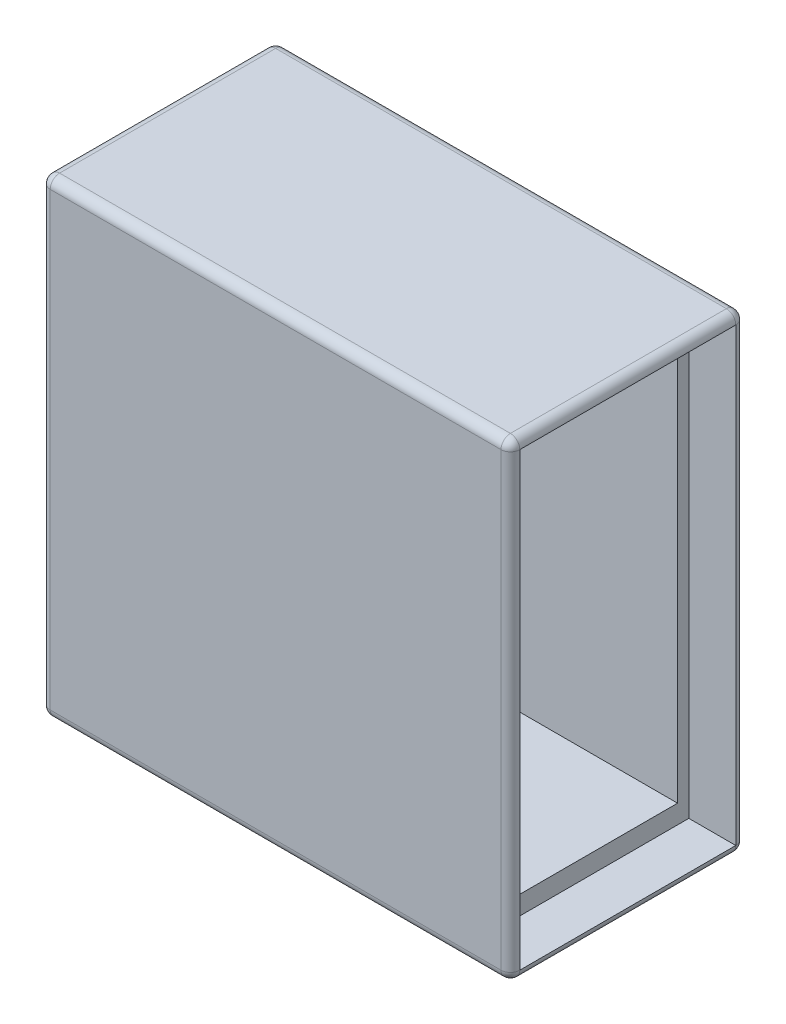
ISO-10303-21;
HEADER;
FILE_DESCRIPTION(('STEP AP214'),'2;1');
FILE_NAME('part.step','',(''),(''),'','','');
FILE_SCHEMA(('AUTOMOTIVE_DESIGN { 1 0 10303 214 1 1 1 1 }'));
ENDSEC;
DATA;
#1=APPLICATION_CONTEXT('core data for automotive mechanical design processes');
#2=APPLICATION_PROTOCOL_DEFINITION('international standard','automotive_design',2000,#1);
#3=PRODUCT_CONTEXT('',#1,'mechanical');
#4=PRODUCT('Part','Part','',(#3));
#5=PRODUCT_RELATED_PRODUCT_CATEGORY('part','',(#4));
#6=PRODUCT_DEFINITION_FORMATION('','',#4);
#7=PRODUCT_DEFINITION_CONTEXT('part definition',#1,'design');
#8=PRODUCT_DEFINITION('design','',#6,#7);
#9=PRODUCT_DEFINITION_SHAPE('','',#8);
#10=(LENGTH_UNIT() NAMED_UNIT(*) SI_UNIT(.MILLI.,.METRE.));
#11=(NAMED_UNIT(*) PLANE_ANGLE_UNIT() SI_UNIT($,.RADIAN.));
#12=(NAMED_UNIT(*) SI_UNIT($,.STERADIAN.) SOLID_ANGLE_UNIT());
#13=UNCERTAINTY_MEASURE_WITH_UNIT(LENGTH_MEASURE(1.E-05),#10,'distance_accuracy_value','');
#14=(GEOMETRIC_REPRESENTATION_CONTEXT(3) GLOBAL_UNCERTAINTY_ASSIGNED_CONTEXT((#13)) GLOBAL_UNIT_ASSIGNED_CONTEXT((#10,
#11,#12)) REPRESENTATION_CONTEXT('',''));
#15=CARTESIAN_POINT('',(0.,0.,0.));
#16=DIRECTION('',(0.,0.,1.));
#17=DIRECTION('',(1.,0.,0.));
#18=AXIS2_PLACEMENT_3D('',#15,#16,#17);
#19=CARTESIAN_POINT('',(5.,50.,-25.));
#20=DIRECTION('',(-1.,0.,0.));
#21=DIRECTION('',(0.,0.,1.));
#22=AXIS2_PLACEMENT_3D('',#19,#20,#21);
#23=PLANE('',#22);
#24=CARTESIAN_POINT('',(5.,8.12499999999999,-12.5));
#25=DIRECTION('',(-1.,0.,0.));
#26=DIRECTION('',(0.,0.,1.));
#27=AXIS2_PLACEMENT_3D('',#24,#25,#26);
#28=CIRCLE('',#27,3.125);
#29=CARTESIAN_POINT('',(5.,8.12499999999999,-9.375));
#30=VERTEX_POINT('',#29);
#31=EDGE_CURVE('E229',#30,#30,#28,.T.);
#32=ORIENTED_EDGE('',*,*,#31,.T.);
#33=EDGE_LOOP('',(#32));
#34=FACE_BOUND('',#33,.T.);
#35=CARTESIAN_POINT('',(5.,28.,-19.5));
#36=DIRECTION('',(-1.,0.,0.));
#37=DIRECTION('',(0.,0.,1.));
#38=AXIS2_PLACEMENT_3D('',#35,#36,#37);
#39=CIRCLE('',#38,3.125);
#40=CARTESIAN_POINT('',(5.,28.,-16.375));
#41=VERTEX_POINT('',#40);
#42=EDGE_CURVE('E223',#41,#41,#39,.T.);
#43=ORIENTED_EDGE('',*,*,#42,.T.);
#44=EDGE_LOOP('',(#43));
#45=FACE_BOUND('',#44,.T.);
#46=CARTESIAN_POINT('',(5.,18.625,-19.5));
#47=DIRECTION('',(-1.,0.,0.));
#48=DIRECTION('',(0.,0.,1.));
#49=AXIS2_PLACEMENT_3D('',#46,#47,#48);
#50=CIRCLE('',#49,3.125);
#51=CARTESIAN_POINT('',(5.,18.625,-16.375));
#52=VERTEX_POINT('',#51);
#53=EDGE_CURVE('E226',#52,#52,#50,.T.);
#54=ORIENTED_EDGE('',*,*,#53,.T.);
#55=EDGE_LOOP('',(#54));
#56=FACE_BOUND('',#55,.T.);
#57=CARTESIAN_POINT('',(5.,28.,-5.5));
#58=DIRECTION('',(-1.,0.,0.));
#59=DIRECTION('',(0.,0.,1.));
#60=AXIS2_PLACEMENT_3D('',#57,#58,#59);
#61=CIRCLE('',#60,3.125);
#62=CARTESIAN_POINT('',(5.,28.,-2.375));
#63=VERTEX_POINT('',#62);
#64=EDGE_CURVE('E220',#63,#63,#61,.T.);
#65=ORIENTED_EDGE('',*,*,#64,.T.);
#66=EDGE_LOOP('',(#65));
#67=FACE_BOUND('',#66,.T.);
#68=CARTESIAN_POINT('',(5.,18.625,-5.5));
#69=DIRECTION('',(-1.,0.,0.));
#70=DIRECTION('',(0.,0.,1.));
#71=AXIS2_PLACEMENT_3D('',#68,#69,#70);
#72=CIRCLE('',#71,3.125);
#73=CARTESIAN_POINT('',(5.,18.625,-2.375));
#74=VERTEX_POINT('',#73);
#75=EDGE_CURVE('E206',#74,#74,#72,.T.);
#76=ORIENTED_EDGE('',*,*,#75,.T.);
#77=EDGE_LOOP('',(#76));
#78=FACE_BOUND('',#77,.T.);
#79=CARTESIAN_POINT('',(5.,40.625,-12.4883404816494));
#80=DIRECTION('',(-1.,0.,0.));
#81=DIRECTION('',(0.,0.,1.));
#82=AXIS2_PLACEMENT_3D('',#79,#80,#81);
#83=CIRCLE('',#82,3.75);
#84=CARTESIAN_POINT('',(5.,40.625,-8.73834048164937));
#85=VERTEX_POINT('',#84);
#86=EDGE_CURVE('E256',#85,#85,#83,.T.);
#87=ORIENTED_EDGE('',*,*,#86,.T.);
#88=EDGE_LOOP('',(#87));
#89=FACE_BOUND('',#88,.T.);
#90=DIRECTION('',(0.,0.,1.));
#91=VECTOR('',#90,1.);
#92=CARTESIAN_POINT('',(5.,47.,-2.20000000000001));
#93=LINE('',#92,#91);
#94=CARTESIAN_POINT('',(5.,47.,-22.8));
#95=VERTEX_POINT('',#94);
#96=CARTESIAN_POINT('',(5.,47.,-2.20000000000001));
#97=VERTEX_POINT('',#96);
#98=EDGE_CURVE('E167',#95,#97,#93,.T.);
#99=ORIENTED_EDGE('',*,*,#98,.T.);
#100=DIRECTION('',(0.,-1.,0.));
#101=VECTOR('',#100,1.);
#102=CARTESIAN_POINT('',(5.,3.,-2.2));
#103=LINE('',#102,#101);
#104=CARTESIAN_POINT('',(5.,3.,-2.2));
#105=VERTEX_POINT('',#104);
#106=EDGE_CURVE('E176',#97,#105,#103,.T.);
#107=ORIENTED_EDGE('',*,*,#106,.T.);
#108=DIRECTION('',(0.,0.,-1.));
#109=VECTOR('',#108,1.);
#110=CARTESIAN_POINT('',(5.,3.,-22.8));
#111=LINE('',#110,#109);
#112=CARTESIAN_POINT('',(5.,3.,-22.8));
#113=VERTEX_POINT('',#112);
#114=EDGE_CURVE('E181',#105,#113,#111,.T.);
#115=ORIENTED_EDGE('',*,*,#114,.T.);
#116=DIRECTION('',(0.,1.,0.));
#117=VECTOR('',#116,1.);
#118=CARTESIAN_POINT('',(5.,47.,-22.8));
#119=LINE('',#118,#117);
#120=EDGE_CURVE('E173',#113,#95,#119,.T.);
#121=ORIENTED_EDGE('',*,*,#120,.T.);
#122=EDGE_LOOP('',(#99,#107,#115,#121));
#123=FACE_BOUND('',#122,.T.);
#124=ADVANCED_FACE('F38',(#34,#45,#56,#67,#78,#89,#123),#23,.F.);
#125=CARTESIAN_POINT('',(17.5,40.625,-12.4883404816494));
#126=DIRECTION('',(-1.,0.,0.));
#127=DIRECTION('',(0.,0.,1.));
#128=AXIS2_PLACEMENT_3D('',#125,#126,#127);
#129=CYLINDRICAL_SURFACE('',#128,3.75);
#130=CARTESIAN_POINT('',(0.,40.625,-12.4883404816494));
#131=DIRECTION('',(-1.,0.,0.));
#132=DIRECTION('',(0.,0.,1.));
#133=AXIS2_PLACEMENT_3D('',#130,#131,#132);
#134=CIRCLE('',#133,3.75);
#135=CARTESIAN_POINT('',(0.,40.625,-8.73834048164937));
#136=VERTEX_POINT('',#135);
#137=EDGE_CURVE('E253',#136,#136,#134,.T.);
#138=ORIENTED_EDGE('',*,*,#137,.T.);
#139=EDGE_LOOP('',(#138));
#140=FACE_BOUND('',#139,.T.);
#141=ORIENTED_EDGE('',*,*,#86,.F.);
#142=EDGE_LOOP('',(#141));
#143=FACE_BOUND('',#142,.T.);
#144=ADVANCED_FACE('F449',(#140,#143),#129,.F.);
#145=CARTESIAN_POINT('',(0.,50.,-25.));
#146=DIRECTION('',(-1.,0.,0.));
#147=DIRECTION('',(0.,0.,1.));
#148=AXIS2_PLACEMENT_3D('',#145,#146,#147);
#149=PLANE('',#148);
#150=CARTESIAN_POINT('',(0.,8.12499999999999,-12.5));
#151=DIRECTION('',(-1.,0.,0.));
#152=DIRECTION('',(0.,0.,1.));
#153=AXIS2_PLACEMENT_3D('',#150,#151,#152);
#154=CIRCLE('',#153,3.125);
#155=CARTESIAN_POINT('',(0.,8.12499999999999,-9.375));
#156=VERTEX_POINT('',#155);
#157=EDGE_CURVE('E203',#156,#156,#154,.T.);
#158=ORIENTED_EDGE('',*,*,#157,.F.);
#159=EDGE_LOOP('',(#158));
#160=FACE_BOUND('',#159,.T.);
#161=CARTESIAN_POINT('',(0.,18.625,-19.5));
#162=DIRECTION('',(-1.,0.,0.));
#163=DIRECTION('',(0.,0.,1.));
#164=AXIS2_PLACEMENT_3D('',#161,#162,#163);
#165=CIRCLE('',#164,3.125);
#166=CARTESIAN_POINT('',(0.,18.625,-16.375));
#167=VERTEX_POINT('',#166);
#168=EDGE_CURVE('E207',#167,#167,#165,.T.);
#169=ORIENTED_EDGE('',*,*,#168,.F.);
#170=EDGE_LOOP('',(#169));
#171=FACE_BOUND('',#170,.T.);
#172=CARTESIAN_POINT('',(0.,28.,-19.5));
#173=DIRECTION('',(-1.,0.,0.));
#174=DIRECTION('',(0.,0.,1.));
#175=AXIS2_PLACEMENT_3D('',#172,#173,#174);
#176=CIRCLE('',#175,3.125);
#177=CARTESIAN_POINT('',(0.,28.,-16.375));
#178=VERTEX_POINT('',#177);
#179=EDGE_CURVE('E210',#178,#178,#176,.T.);
#180=ORIENTED_EDGE('',*,*,#179,.F.);
#181=EDGE_LOOP('',(#180));
#182=FACE_BOUND('',#181,.T.);
#183=CARTESIAN_POINT('',(0.,28.,-5.5));
#184=DIRECTION('',(-1.,0.,0.));
#185=DIRECTION('',(0.,0.,1.));
#186=AXIS2_PLACEMENT_3D('',#183,#184,#185);
#187=CIRCLE('',#186,3.125);
#188=CARTESIAN_POINT('',(0.,28.,-2.375));
#189=VERTEX_POINT('',#188);
#190=EDGE_CURVE('E213',#189,#189,#187,.T.);
#191=ORIENTED_EDGE('',*,*,#190,.F.);
#192=EDGE_LOOP('',(#191));
#193=FACE_BOUND('',#192,.T.);
#194=CARTESIAN_POINT('',(0.,18.625,-5.5));
#195=DIRECTION('',(-1.,0.,0.));
#196=DIRECTION('',(0.,0.,1.));
#197=AXIS2_PLACEMENT_3D('',#194,#195,#196);
#198=CIRCLE('',#197,3.125);
#199=CARTESIAN_POINT('',(0.,18.625,-2.375));
#200=VERTEX_POINT('',#199);
#201=EDGE_CURVE('E199',#200,#200,#198,.T.);
#202=ORIENTED_EDGE('',*,*,#201,.F.);
#203=EDGE_LOOP('',(#202));
#204=FACE_BOUND('',#203,.T.);
#205=DIRECTION('',(0.,-1.,0.));
#206=VECTOR('',#205,1.);
#207=CARTESIAN_POINT('',(0.,50.,-1.));
#208=LINE('',#207,#206);
#209=CARTESIAN_POINT('',(0.,1.,-1.));
#210=VERTEX_POINT('',#209);
#211=CARTESIAN_POINT('',(0.,49.,-1.));
#212=VERTEX_POINT('',#211);
#213=EDGE_CURVE('E268',#210,#212,#208,.F.);
#214=ORIENTED_EDGE('',*,*,#213,.T.);
#215=DIRECTION('',(0.,0.,1.));
#216=VECTOR('',#215,1.);
#217=CARTESIAN_POINT('',(0.,49.,-25.));
#218=LINE('',#217,#216);
#219=CARTESIAN_POINT('',(0.,49.,-24.));
#220=VERTEX_POINT('',#219);
#221=EDGE_CURVE('E274',#212,#220,#218,.F.);
#222=ORIENTED_EDGE('',*,*,#221,.T.);
#223=DIRECTION('',(0.,-1.,0.));
#224=VECTOR('',#223,1.);
#225=CARTESIAN_POINT('',(0.,0.,-24.));
#226=LINE('',#225,#224);
#227=CARTESIAN_POINT('',(0.,1.,-24.));
#228=VERTEX_POINT('',#227);
#229=EDGE_CURVE('E272',#220,#228,#226,.T.);
#230=ORIENTED_EDGE('',*,*,#229,.T.);
#231=DIRECTION('',(0.,0.,1.));
#232=VECTOR('',#231,1.);
#233=CARTESIAN_POINT('',(0.,1.,-25.));
#234=LINE('',#233,#232);
#235=EDGE_CURVE('E270',#228,#210,#234,.T.);
#236=ORIENTED_EDGE('',*,*,#235,.T.);
#237=EDGE_LOOP('',(#214,#222,#230,#236));
#238=FACE_BOUND('',#237,.T.);
#239=ORIENTED_EDGE('',*,*,#137,.F.);
#240=EDGE_LOOP('',(#239));
#241=FACE_BOUND('',#240,.T.);
#242=ADVANCED_FACE('F457',(#160,#171,#182,#193,#204,#238,#241),#149,.T.);
#243=CARTESIAN_POINT('',(50.,50.,-25.));
#244=DIRECTION('',(0.,1.,0.));
#245=DIRECTION('',(-1.,0.,0.));
#246=AXIS2_PLACEMENT_3D('',#243,#244,#245);
#247=PLANE('',#246);
#248=DIRECTION('',(-1.,0.,0.));
#249=VECTOR('',#248,1.);
#250=CARTESIAN_POINT('',(0.,50.,-24.));
#251=LINE('',#250,#249);
#252=CARTESIAN_POINT('',(49.,50.,-24.));
#253=VERTEX_POINT('',#252);
#254=CARTESIAN_POINT('',(1.,50.,-24.));
#255=VERTEX_POINT('',#254);
#256=EDGE_CURVE('E263',#253,#255,#251,.T.);
#257=ORIENTED_EDGE('',*,*,#256,.T.);
#258=DIRECTION('',(0.,0.,1.));
#259=VECTOR('',#258,1.);
#260=CARTESIAN_POINT('',(1.,50.,-25.));
#261=LINE('',#260,#259);
#262=CARTESIAN_POINT('',(1.,50.,-1.));
#263=VERTEX_POINT('',#262);
#264=EDGE_CURVE('E265',#255,#263,#261,.T.);
#265=ORIENTED_EDGE('',*,*,#264,.T.);
#266=DIRECTION('',(-1.,0.,0.));
#267=VECTOR('',#266,1.);
#268=CARTESIAN_POINT('',(50.,50.,-1.));
#269=LINE('',#268,#267);
#270=CARTESIAN_POINT('',(49.,50.,-1.));
#271=VERTEX_POINT('',#270);
#272=EDGE_CURVE('E259',#263,#271,#269,.F.);
#273=ORIENTED_EDGE('',*,*,#272,.T.);
#274=DIRECTION('',(0.,0.,1.));
#275=VECTOR('',#274,1.);
#276=CARTESIAN_POINT('',(49.,50.,-25.));
#277=LINE('',#276,#275);
#278=EDGE_CURVE('E261',#271,#253,#277,.F.);
#279=ORIENTED_EDGE('',*,*,#278,.T.);
#280=EDGE_LOOP('',(#257,#265,#273,#279));
#281=FACE_BOUND('',#280,.T.);
#282=ADVANCED_FACE('F625',(#281),#247,.T.);
#283=CARTESIAN_POINT('',(0.,0.,-25.));
#284=DIRECTION('',(0.,-1.,0.));
#285=DIRECTION('',(0.,0.,-1.));
#286=AXIS2_PLACEMENT_3D('',#283,#284,#285);
#287=PLANE('',#286);
#288=DIRECTION('',(0.,0.,1.));
#289=VECTOR('',#288,1.);
#290=CARTESIAN_POINT('',(1.,0.,-25.));
#291=LINE('',#290,#289);
#292=CARTESIAN_POINT('',(1.,0.,-1.));
#293=VERTEX_POINT('',#292);
#294=CARTESIAN_POINT('',(1.,0.,-24.));
#295=VERTEX_POINT('',#294);
#296=EDGE_CURVE('E286',#293,#295,#291,.F.);
#297=ORIENTED_EDGE('',*,*,#296,.T.);
#298=DIRECTION('',(1.,0.,0.));
#299=VECTOR('',#298,1.);
#300=CARTESIAN_POINT('',(50.,0.,-24.));
#301=LINE('',#300,#299);
#302=CARTESIAN_POINT('',(49.,0.,-24.));
#303=VERTEX_POINT('',#302);
#304=EDGE_CURVE('E292',#295,#303,#301,.T.);
#305=ORIENTED_EDGE('',*,*,#304,.T.);
#306=DIRECTION('',(0.,0.,1.));
#307=VECTOR('',#306,1.);
#308=CARTESIAN_POINT('',(49.,0.,-25.));
#309=LINE('',#308,#307);
#310=CARTESIAN_POINT('',(49.,0.,-1.));
#311=VERTEX_POINT('',#310);
#312=EDGE_CURVE('E290',#303,#311,#309,.T.);
#313=ORIENTED_EDGE('',*,*,#312,.T.);
#314=DIRECTION('',(1.,0.,0.));
#315=VECTOR('',#314,1.);
#316=CARTESIAN_POINT('',(0.,0.,-1.));
#317=LINE('',#316,#315);
#318=EDGE_CURVE('E288',#311,#293,#317,.F.);
#319=ORIENTED_EDGE('',*,*,#318,.T.);
#320=EDGE_LOOP('',(#297,#305,#313,#319));
#321=FACE_BOUND('',#320,.T.);
#322=ADVANCED_FACE('F389',(#321),#287,.T.);
#323=CARTESIAN_POINT('',(0.,0.,-25.));
#324=DIRECTION('',(0.,0.,1.));
#325=DIRECTION('',(1.,0.,0.));
#326=AXIS2_PLACEMENT_3D('',#323,#324,#325);
#327=PLANE('',#326);
#328=DIRECTION('',(1.,0.,0.));
#329=VECTOR('',#328,1.);
#330=CARTESIAN_POINT('',(0.,1.,-25.));
#331=LINE('',#330,#329);
#332=CARTESIAN_POINT('',(49.,1.,-25.));
#333=VERTEX_POINT('',#332);
#334=CARTESIAN_POINT('',(1.,1.,-25.));
#335=VERTEX_POINT('',#334);
#336=EDGE_CURVE('E279',#333,#335,#331,.F.);
#337=ORIENTED_EDGE('',*,*,#336,.T.);
#338=DIRECTION('',(0.,-1.,0.));
#339=VECTOR('',#338,1.);
#340=CARTESIAN_POINT('',(1.,50.,-25.));
#341=LINE('',#340,#339);
#342=CARTESIAN_POINT('',(1.,49.,-25.));
#343=VERTEX_POINT('',#342);
#344=EDGE_CURVE('E283',#335,#343,#341,.F.);
#345=ORIENTED_EDGE('',*,*,#344,.T.);
#346=DIRECTION('',(-1.,0.,0.));
#347=VECTOR('',#346,1.);
#348=CARTESIAN_POINT('',(50.,49.,-25.));
#349=LINE('',#348,#347);
#350=CARTESIAN_POINT('',(49.,49.,-25.));
#351=VERTEX_POINT('',#350);
#352=EDGE_CURVE('E281',#343,#351,#349,.F.);
#353=ORIENTED_EDGE('',*,*,#352,.T.);
#354=DIRECTION('',(0.,1.,0.));
#355=VECTOR('',#354,1.);
#356=CARTESIAN_POINT('',(49.,0.,-25.));
#357=LINE('',#356,#355);
#358=EDGE_CURVE('E277',#351,#333,#357,.F.);
#359=ORIENTED_EDGE('',*,*,#358,.T.);
#360=EDGE_LOOP('',(#337,#345,#353,#359));
#361=FACE_BOUND('',#360,.T.);
#362=ADVANCED_FACE('F410',(#361),#327,.F.);
#363=CARTESIAN_POINT('',(0.,0.,0.));
#364=DIRECTION('',(0.,0.,1.));
#365=DIRECTION('',(1.,0.,0.));
#366=AXIS2_PLACEMENT_3D('',#363,#364,#365);
#367=PLANE('',#366);
#368=DIRECTION('',(1.,0.,0.));
#369=VECTOR('',#368,1.);
#370=CARTESIAN_POINT('',(0.,1.,0.));
#371=LINE('',#370,#369);
#372=CARTESIAN_POINT('',(1.,1.,0.));
#373=VERTEX_POINT('',#372);
#374=CARTESIAN_POINT('',(49.,1.,0.));
#375=VERTEX_POINT('',#374);
#376=EDGE_CURVE('E297',#373,#375,#371,.T.);
#377=ORIENTED_EDGE('',*,*,#376,.T.);
#378=DIRECTION('',(0.,1.,0.));
#379=VECTOR('',#378,1.);
#380=CARTESIAN_POINT('',(49.,0.,0.));
#381=LINE('',#380,#379);
#382=CARTESIAN_POINT('',(49.,49.,0.));
#383=VERTEX_POINT('',#382);
#384=EDGE_CURVE('E301',#375,#383,#381,.T.);
#385=ORIENTED_EDGE('',*,*,#384,.T.);
#386=DIRECTION('',(-1.,0.,0.));
#387=VECTOR('',#386,1.);
#388=CARTESIAN_POINT('',(0.,49.,0.));
#389=LINE('',#388,#387);
#390=CARTESIAN_POINT('',(1.,49.,0.));
#391=VERTEX_POINT('',#390);
#392=EDGE_CURVE('E299',#383,#391,#389,.T.);
#393=ORIENTED_EDGE('',*,*,#392,.T.);
#394=DIRECTION('',(0.,-1.,0.));
#395=VECTOR('',#394,1.);
#396=CARTESIAN_POINT('',(1.,0.,0.));
#397=LINE('',#396,#395);
#398=EDGE_CURVE('E295',#391,#373,#397,.T.);
#399=ORIENTED_EDGE('',*,*,#398,.T.);
#400=EDGE_LOOP('',(#377,#385,#393,#399));
#401=FACE_BOUND('',#400,.T.);
#402=ADVANCED_FACE('F434',(#401),#367,.T.);
#403=CARTESIAN_POINT('',(49.,1.,-25.));
#404=DIRECTION('',(0.,0.,1.));
#405=DIRECTION('',(1.,0.,0.));
#406=AXIS2_PLACEMENT_3D('',#403,#404,#405);
#407=CYLINDRICAL_SURFACE('',#406,1.);
#408=CARTESIAN_POINT('',(49.,1.,-24.));
#409=DIRECTION('',(0.,0.,-1.));
#410=DIRECTION('',(-1.,0.,0.));
#411=AXIS2_PLACEMENT_3D('',#408,#409,#410);
#412=CIRCLE('',#411,1.);
#413=CARTESIAN_POINT('',(50.,1.,-24.));
#414=VERTEX_POINT('',#413);
#415=EDGE_CURVE('E42',#414,#303,#412,.T.);
#416=ORIENTED_EDGE('',*,*,#415,.F.);
#417=DIRECTION('',(0.,0.,1.));
#418=VECTOR('',#417,1.);
#419=CARTESIAN_POINT('',(50.,1.,-25.));
#420=LINE('',#419,#418);
#421=CARTESIAN_POINT('',(50.,1.,-1.));
#422=VERTEX_POINT('',#421);
#423=EDGE_CURVE('E47',#422,#414,#420,.F.);
#424=ORIENTED_EDGE('',*,*,#423,.F.);
#425=CARTESIAN_POINT('',(49.,1.,-1.));
#426=DIRECTION('',(0.,0.,1.));
#427=DIRECTION('',(1.,0.,0.));
#428=AXIS2_PLACEMENT_3D('',#425,#426,#427);
#429=CIRCLE('',#428,1.);
#430=EDGE_CURVE('E370',#311,#422,#429,.T.);
#431=ORIENTED_EDGE('',*,*,#430,.F.);
#432=ORIENTED_EDGE('',*,*,#312,.F.);
#433=EDGE_LOOP('',(#416,#424,#431,#432));
#434=FACE_BOUND('',#433,.T.);
#435=ADVANCED_FACE('F40',(#434),#407,.T.);
#436=CARTESIAN_POINT('',(49.,1.,-24.));
#437=DIRECTION('',(0.,-1.,0.));
#438=DIRECTION('',(0.,0.,-1.));
#439=AXIS2_PLACEMENT_3D('',#436,#437,#438);
#440=SPHERICAL_SURFACE('',#439,1.);
#441=CARTESIAN_POINT('',(49.,1.,-24.));
#442=DIRECTION('',(0.,-1.,0.));
#443=DIRECTION('',(0.,0.,-1.));
#444=AXIS2_PLACEMENT_3D('',#441,#442,#443);
#445=CIRCLE('',#444,1.);
#446=EDGE_CURVE('E366',#414,#333,#445,.F.);
#447=ORIENTED_EDGE('',*,*,#446,.F.);
#448=ORIENTED_EDGE('',*,*,#415,.T.);
#449=CARTESIAN_POINT('',(49.,1.,-24.));
#450=DIRECTION('',(1.,0.,0.));
#451=DIRECTION('',(0.,0.,-1.));
#452=AXIS2_PLACEMENT_3D('',#449,#450,#451);
#453=CIRCLE('',#452,1.);
#454=EDGE_CURVE('E369',#333,#303,#453,.F.);
#455=ORIENTED_EDGE('',*,*,#454,.F.);
#456=EDGE_LOOP('',(#447,#448,#455));
#457=FACE_BOUND('',#456,.T.);
#458=ADVANCED_FACE('F383',(#457),#440,.T.);
#459=CARTESIAN_POINT('',(49.,1.,-1.));
#460=DIRECTION('',(1.,0.,0.));
#461=DIRECTION('',(0.,0.,-1.));
#462=AXIS2_PLACEMENT_3D('',#459,#460,#461);
#463=SPHERICAL_SURFACE('',#462,1.);
#464=CARTESIAN_POINT('',(49.,1.,-1.));
#465=DIRECTION('',(1.,0.,0.));
#466=DIRECTION('',(0.,0.,-1.));
#467=AXIS2_PLACEMENT_3D('',#464,#465,#466);
#468=CIRCLE('',#467,1.);
#469=EDGE_CURVE('E360',#311,#375,#468,.F.);
#470=ORIENTED_EDGE('',*,*,#469,.F.);
#471=ORIENTED_EDGE('',*,*,#430,.T.);
#472=CARTESIAN_POINT('',(49.,1.,-1.));
#473=DIRECTION('',(0.,-1.,0.));
#474=DIRECTION('',(0.,0.,-1.));
#475=AXIS2_PLACEMENT_3D('',#472,#473,#474);
#476=CIRCLE('',#475,1.);
#477=EDGE_CURVE('E363',#375,#422,#476,.F.);
#478=ORIENTED_EDGE('',*,*,#477,.F.);
#479=EDGE_LOOP('',(#470,#471,#478));
#480=FACE_BOUND('',#479,.T.);
#481=ADVANCED_FACE('F440',(#480),#463,.T.);
#482=CARTESIAN_POINT('',(0.,1.,-24.));
#483=DIRECTION('',(-1.,0.,0.));
#484=DIRECTION('',(0.,0.,1.));
#485=AXIS2_PLACEMENT_3D('',#482,#483,#484);
#486=CYLINDRICAL_SURFACE('',#485,1.);
#487=ORIENTED_EDGE('',*,*,#454,.T.);
#488=ORIENTED_EDGE('',*,*,#304,.F.);
#489=CARTESIAN_POINT('',(1.,1.,-24.));
#490=DIRECTION('',(-1.,0.,0.));
#491=DIRECTION('',(0.,0.,1.));
#492=AXIS2_PLACEMENT_3D('',#489,#490,#491);
#493=CIRCLE('',#492,1.);
#494=EDGE_CURVE('E354',#335,#295,#493,.T.);
#495=ORIENTED_EDGE('',*,*,#494,.F.);
#496=ORIENTED_EDGE('',*,*,#336,.F.);
#497=EDGE_LOOP('',(#487,#488,#495,#496));
#498=FACE_BOUND('',#497,.T.);
#499=ADVANCED_FACE('F394',(#498),#486,.T.);
#500=CARTESIAN_POINT('',(49.,0.,-24.));
#501=DIRECTION('',(0.,-1.,0.));
#502=DIRECTION('',(0.,0.,-1.));
#503=AXIS2_PLACEMENT_3D('',#500,#501,#502);
#504=CYLINDRICAL_SURFACE('',#503,1.);
#505=ORIENTED_EDGE('',*,*,#446,.T.);
#506=ORIENTED_EDGE('',*,*,#358,.F.);
#507=CARTESIAN_POINT('',(49.,49.,-24.));
#508=DIRECTION('',(0.,1.,0.));
#509=DIRECTION('',(0.,0.,1.));
#510=AXIS2_PLACEMENT_3D('',#507,#508,#509);
#511=CIRCLE('',#510,1.);
#512=CARTESIAN_POINT('',(50.,49.,-24.));
#513=VERTEX_POINT('',#512);
#514=EDGE_CURVE('E351',#513,#351,#511,.T.);
#515=ORIENTED_EDGE('',*,*,#514,.F.);
#516=DIRECTION('',(0.,1.,0.));
#517=VECTOR('',#516,1.);
#518=CARTESIAN_POINT('',(50.,50.,-24.));
#519=LINE('',#518,#517);
#520=EDGE_CURVE('E305',#414,#513,#519,.T.);
#521=ORIENTED_EDGE('',*,*,#520,.F.);
#522=EDGE_LOOP('',(#505,#506,#515,#521));
#523=FACE_BOUND('',#522,.T.);
#524=ADVANCED_FACE('F414',(#523),#504,.T.);
#525=CARTESIAN_POINT('',(49.,49.,-25.));
#526=DIRECTION('',(0.,0.,1.));
#527=DIRECTION('',(1.,0.,0.));
#528=AXIS2_PLACEMENT_3D('',#525,#526,#527);
#529=CYLINDRICAL_SURFACE('',#528,1.);
#530=CARTESIAN_POINT('',(49.,49.,-1.));
#531=DIRECTION('',(0.,0.,1.));
#532=DIRECTION('',(1.,0.,0.));
#533=AXIS2_PLACEMENT_3D('',#530,#531,#532);
#534=CIRCLE('',#533,1.);
#535=CARTESIAN_POINT('',(50.,49.,-1.));
#536=VERTEX_POINT('',#535);
#537=EDGE_CURVE('E345',#536,#271,#534,.T.);
#538=ORIENTED_EDGE('',*,*,#537,.F.);
#539=DIRECTION('',(0.,0.,1.));
#540=VECTOR('',#539,1.);
#541=CARTESIAN_POINT('',(50.,49.,-25.));
#542=LINE('',#541,#540);
#543=EDGE_CURVE('E63',#513,#536,#542,.T.);
#544=ORIENTED_EDGE('',*,*,#543,.F.);
#545=CARTESIAN_POINT('',(49.,49.,-24.));
#546=DIRECTION('',(0.,0.,-1.));
#547=DIRECTION('',(-1.,0.,0.));
#548=AXIS2_PLACEMENT_3D('',#545,#546,#547);
#549=CIRCLE('',#548,1.);
#550=EDGE_CURVE('E348',#253,#513,#549,.T.);
#551=ORIENTED_EDGE('',*,*,#550,.F.);
#552=ORIENTED_EDGE('',*,*,#278,.F.);
#553=EDGE_LOOP('',(#538,#544,#551,#552));
#554=FACE_BOUND('',#553,.T.);
#555=ADVANCED_FACE('F422',(#554),#529,.T.);
#556=CARTESIAN_POINT('',(49.,0.,-1.));
#557=DIRECTION('',(0.,1.,0.));
#558=DIRECTION('',(0.,0.,1.));
#559=AXIS2_PLACEMENT_3D('',#556,#557,#558);
#560=CYLINDRICAL_SURFACE('',#559,1.);
#561=ORIENTED_EDGE('',*,*,#477,.T.);
#562=DIRECTION('',(0.,1.,0.));
#563=VECTOR('',#562,1.);
#564=CARTESIAN_POINT('',(50.,0.,-1.));
#565=LINE('',#564,#563);
#566=EDGE_CURVE('E11',#536,#422,#565,.F.);
#567=ORIENTED_EDGE('',*,*,#566,.F.);
#568=CARTESIAN_POINT('',(49.,49.,-1.));
#569=DIRECTION('',(0.,1.,0.));
#570=DIRECTION('',(0.,0.,1.));
#571=AXIS2_PLACEMENT_3D('',#568,#569,#570);
#572=CIRCLE('',#571,1.);
#573=EDGE_CURVE('E342',#383,#536,#572,.T.);
#574=ORIENTED_EDGE('',*,*,#573,.F.);
#575=ORIENTED_EDGE('',*,*,#384,.F.);
#576=EDGE_LOOP('',(#561,#567,#574,#575));
#577=FACE_BOUND('',#576,.T.);
#578=ADVANCED_FACE('F432',(#577),#560,.T.);
#579=CARTESIAN_POINT('',(0.,1.,-1.));
#580=DIRECTION('',(1.,0.,0.));
#581=DIRECTION('',(0.,0.,-1.));
#582=AXIS2_PLACEMENT_3D('',#579,#580,#581);
#583=CYLINDRICAL_SURFACE('',#582,1.);
#584=ORIENTED_EDGE('',*,*,#469,.T.);
#585=ORIENTED_EDGE('',*,*,#376,.F.);
#586=CARTESIAN_POINT('',(1.,1.,-1.));
#587=DIRECTION('',(-1.,0.,0.));
#588=DIRECTION('',(0.,0.,1.));
#589=AXIS2_PLACEMENT_3D('',#586,#587,#588);
#590=CIRCLE('',#589,1.);
#591=EDGE_CURVE('E339',#293,#373,#590,.T.);
#592=ORIENTED_EDGE('',*,*,#591,.F.);
#593=ORIENTED_EDGE('',*,*,#318,.F.);
#594=EDGE_LOOP('',(#584,#585,#592,#593));
#595=FACE_BOUND('',#594,.T.);
#596=ADVANCED_FACE('F439',(#595),#583,.T.);
#597=CARTESIAN_POINT('',(1.,1.,-25.));
#598=DIRECTION('',(0.,0.,1.));
#599=DIRECTION('',(1.,0.,0.));
#600=AXIS2_PLACEMENT_3D('',#597,#598,#599);
#601=CYLINDRICAL_SURFACE('',#600,1.);
#602=CARTESIAN_POINT('',(1.,1.,-24.));
#603=DIRECTION('',(0.,0.,-1.));
#604=DIRECTION('',(-1.,0.,0.));
#605=AXIS2_PLACEMENT_3D('',#602,#603,#604);
#606=CIRCLE('',#605,1.);
#607=EDGE_CURVE('E357',#295,#228,#606,.T.);
#608=ORIENTED_EDGE('',*,*,#607,.F.);
#609=ORIENTED_EDGE('',*,*,#296,.F.);
#610=CARTESIAN_POINT('',(1.,1.,-1.));
#611=DIRECTION('',(0.,0.,1.));
#612=DIRECTION('',(1.,0.,0.));
#613=AXIS2_PLACEMENT_3D('',#610,#611,#612);
#614=CIRCLE('',#613,1.);
#615=EDGE_CURVE('E336',#210,#293,#614,.T.);
#616=ORIENTED_EDGE('',*,*,#615,.F.);
#617=ORIENTED_EDGE('',*,*,#235,.F.);
#618=EDGE_LOOP('',(#608,#609,#616,#617));
#619=FACE_BOUND('',#618,.T.);
#620=ADVANCED_FACE('F398',(#619),#601,.T.);
#621=CARTESIAN_POINT('',(1.,1.,-24.));
#622=DIRECTION('',(0.,-1.,0.));
#623=DIRECTION('',(0.,0.,-1.));
#624=AXIS2_PLACEMENT_3D('',#621,#622,#623);
#625=SPHERICAL_SURFACE('',#624,1.);
#626=ORIENTED_EDGE('',*,*,#494,.T.);
#627=ORIENTED_EDGE('',*,*,#607,.T.);
#628=CARTESIAN_POINT('',(1.,1.,-24.));
#629=DIRECTION('',(0.,-1.,0.));
#630=DIRECTION('',(0.,0.,-1.));
#631=AXIS2_PLACEMENT_3D('',#628,#629,#630);
#632=CIRCLE('',#631,1.);
#633=EDGE_CURVE('E333',#335,#228,#632,.F.);
#634=ORIENTED_EDGE('',*,*,#633,.F.);
#635=EDGE_LOOP('',(#626,#627,#634));
#636=FACE_BOUND('',#635,.T.);
#637=ADVANCED_FACE('F402',(#636),#625,.T.);
#638=CARTESIAN_POINT('',(49.,49.,-24.));
#639=DIRECTION('',(1.,0.,0.));
#640=DIRECTION('',(0.,0.,-1.));
#641=AXIS2_PLACEMENT_3D('',#638,#639,#640);
#642=SPHERICAL_SURFACE('',#641,1.);
#643=ORIENTED_EDGE('',*,*,#550,.T.);
#644=ORIENTED_EDGE('',*,*,#514,.T.);
#645=CARTESIAN_POINT('',(49.,49.,-24.));
#646=DIRECTION('',(1.,0.,0.));
#647=DIRECTION('',(0.,0.,-1.));
#648=AXIS2_PLACEMENT_3D('',#645,#646,#647);
#649=CIRCLE('',#648,1.);
#650=EDGE_CURVE('E330',#253,#351,#649,.F.);
#651=ORIENTED_EDGE('',*,*,#650,.F.);
#652=EDGE_LOOP('',(#643,#644,#651));
#653=FACE_BOUND('',#652,.T.);
#654=ADVANCED_FACE('F497',(#653),#642,.T.);
#655=CARTESIAN_POINT('',(49.,49.,-1.));
#656=DIRECTION('',(1.,0.,0.));
#657=DIRECTION('',(0.,0.,-1.));
#658=AXIS2_PLACEMENT_3D('',#655,#656,#657);
#659=SPHERICAL_SURFACE('',#658,1.);
#660=ORIENTED_EDGE('',*,*,#573,.T.);
#661=ORIENTED_EDGE('',*,*,#537,.T.);
#662=CARTESIAN_POINT('',(49.,49.,-1.));
#663=DIRECTION('',(1.,0.,0.));
#664=DIRECTION('',(0.,0.,-1.));
#665=AXIS2_PLACEMENT_3D('',#662,#663,#664);
#666=CIRCLE('',#665,1.);
#667=EDGE_CURVE('E327',#383,#271,#666,.F.);
#668=ORIENTED_EDGE('',*,*,#667,.F.);
#669=EDGE_LOOP('',(#660,#661,#668));
#670=FACE_BOUND('',#669,.T.);
#671=ADVANCED_FACE('F428',(#670),#659,.T.);
#672=CARTESIAN_POINT('',(1.,1.,-1.));
#673=DIRECTION('',(0.,-1.,0.));
#674=DIRECTION('',(0.,0.,-1.));
#675=AXIS2_PLACEMENT_3D('',#672,#673,#674);
#676=SPHERICAL_SURFACE('',#675,1.);
#677=ORIENTED_EDGE('',*,*,#615,.T.);
#678=ORIENTED_EDGE('',*,*,#591,.T.);
#679=CARTESIAN_POINT('',(1.,1.,-1.));
#680=DIRECTION('',(0.,-1.,0.));
#681=DIRECTION('',(1.,0.,0.));
#682=AXIS2_PLACEMENT_3D('',#679,#680,#681);
#683=CIRCLE('',#682,1.);
#684=EDGE_CURVE('E324',#210,#373,#683,.F.);
#685=ORIENTED_EDGE('',*,*,#684,.F.);
#686=EDGE_LOOP('',(#677,#678,#685));
#687=FACE_BOUND('',#686,.T.);
#688=ADVANCED_FACE('F491',(#687),#676,.T.);
#689=CARTESIAN_POINT('',(1.,50.,-24.));
#690=DIRECTION('',(0.,1.,0.));
#691=DIRECTION('',(0.,0.,1.));
#692=AXIS2_PLACEMENT_3D('',#689,#690,#691);
#693=CYLINDRICAL_SURFACE('',#692,1.);
#694=ORIENTED_EDGE('',*,*,#633,.T.);
#695=ORIENTED_EDGE('',*,*,#229,.F.);
#696=CARTESIAN_POINT('',(1.,49.,-24.));
#697=DIRECTION('',(0.,1.,0.));
#698=DIRECTION('',(0.,0.,1.));
#699=AXIS2_PLACEMENT_3D('',#696,#697,#698);
#700=CIRCLE('',#699,1.);
#701=EDGE_CURVE('E321',#343,#220,#700,.T.);
#702=ORIENTED_EDGE('',*,*,#701,.F.);
#703=ORIENTED_EDGE('',*,*,#344,.F.);
#704=EDGE_LOOP('',(#694,#695,#702,#703));
#705=FACE_BOUND('',#704,.T.);
#706=ADVANCED_FACE('F407',(#705),#693,.T.);
#707=CARTESIAN_POINT('',(50.,49.,-24.));
#708=DIRECTION('',(1.,0.,0.));
#709=DIRECTION('',(0.,1.,0.));
#710=AXIS2_PLACEMENT_3D('',#707,#708,#709);
#711=CYLINDRICAL_SURFACE('',#710,1.);
#712=ORIENTED_EDGE('',*,*,#650,.T.);
#713=ORIENTED_EDGE('',*,*,#352,.F.);
#714=CARTESIAN_POINT('',(1.,49.,-24.));
#715=DIRECTION('',(-1.,0.,0.));
#716=DIRECTION('',(0.,0.,1.));
#717=AXIS2_PLACEMENT_3D('',#714,#715,#716);
#718=CIRCLE('',#717,1.);
#719=EDGE_CURVE('E319',#255,#343,#718,.T.);
#720=ORIENTED_EDGE('',*,*,#719,.F.);
#721=ORIENTED_EDGE('',*,*,#256,.F.);
#722=EDGE_LOOP('',(#712,#713,#720,#721));
#723=FACE_BOUND('',#722,.T.);
#724=ADVANCED_FACE('F484',(#723),#711,.T.);
#725=CARTESIAN_POINT('',(0.,49.,-1.));
#726=DIRECTION('',(-1.,0.,0.));
#727=DIRECTION('',(0.,-1.,0.));
#728=AXIS2_PLACEMENT_3D('',#725,#726,#727);
#729=CYLINDRICAL_SURFACE('',#728,1.);
#730=ORIENTED_EDGE('',*,*,#667,.T.);
#731=ORIENTED_EDGE('',*,*,#272,.F.);
#732=CARTESIAN_POINT('',(1.,49.,-1.));
#733=DIRECTION('',(-1.,0.,0.));
#734=DIRECTION('',(0.,-1.,0.));
#735=AXIS2_PLACEMENT_3D('',#732,#733,#734);
#736=CIRCLE('',#735,1.);
#737=EDGE_CURVE('E316',#391,#263,#736,.T.);
#738=ORIENTED_EDGE('',*,*,#737,.F.);
#739=ORIENTED_EDGE('',*,*,#392,.F.);
#740=EDGE_LOOP('',(#730,#731,#738,#739));
#741=FACE_BOUND('',#740,.T.);
#742=ADVANCED_FACE('F480',(#741),#729,.T.);
#743=CARTESIAN_POINT('',(1.,0.,-1.));
#744=DIRECTION('',(0.,-1.,0.));
#745=DIRECTION('',(0.,0.,-1.));
#746=AXIS2_PLACEMENT_3D('',#743,#744,#745);
#747=CYLINDRICAL_SURFACE('',#746,1.);
#748=ORIENTED_EDGE('',*,*,#684,.T.);
#749=ORIENTED_EDGE('',*,*,#398,.F.);
#750=CARTESIAN_POINT('',(1.,49.,-1.));
#751=DIRECTION('',(0.,1.,0.));
#752=DIRECTION('',(0.,0.,1.));
#753=AXIS2_PLACEMENT_3D('',#750,#751,#752);
#754=CIRCLE('',#753,1.);
#755=EDGE_CURVE('E313',#212,#391,#754,.T.);
#756=ORIENTED_EDGE('',*,*,#755,.F.);
#757=ORIENTED_EDGE('',*,*,#213,.F.);
#758=EDGE_LOOP('',(#748,#749,#756,#757));
#759=FACE_BOUND('',#758,.T.);
#760=ADVANCED_FACE('F476',(#759),#747,.T.);
#761=CARTESIAN_POINT('',(1.,49.,-24.));
#762=DIRECTION('',(0.,0.,-1.));
#763=DIRECTION('',(-1.,0.,0.));
#764=AXIS2_PLACEMENT_3D('',#761,#762,#763);
#765=SPHERICAL_SURFACE('',#764,1.);
#766=ORIENTED_EDGE('',*,*,#719,.T.);
#767=ORIENTED_EDGE('',*,*,#701,.T.);
#768=CARTESIAN_POINT('',(1.,49.,-24.));
#769=DIRECTION('',(0.,0.,-1.));
#770=DIRECTION('',(-1.,0.,0.));
#771=AXIS2_PLACEMENT_3D('',#768,#769,#770);
#772=CIRCLE('',#771,1.);
#773=EDGE_CURVE('E311',#255,#220,#772,.F.);
#774=ORIENTED_EDGE('',*,*,#773,.F.);
#775=EDGE_LOOP('',(#766,#767,#774));
#776=FACE_BOUND('',#775,.T.);
#777=ADVANCED_FACE('F472',(#776),#765,.T.);
#778=CARTESIAN_POINT('',(1.,49.,-1.));
#779=DIRECTION('',(0.,0.,1.));
#780=DIRECTION('',(1.,0.,0.));
#781=AXIS2_PLACEMENT_3D('',#778,#779,#780);
#782=SPHERICAL_SURFACE('',#781,1.);
#783=ORIENTED_EDGE('',*,*,#755,.T.);
#784=ORIENTED_EDGE('',*,*,#737,.T.);
#785=CARTESIAN_POINT('',(1.,49.,-1.));
#786=DIRECTION('',(0.,0.,1.));
#787=DIRECTION('',(1.,0.,0.));
#788=AXIS2_PLACEMENT_3D('',#785,#786,#787);
#789=CIRCLE('',#788,1.);
#790=EDGE_CURVE('E247',#212,#263,#789,.F.);
#791=ORIENTED_EDGE('',*,*,#790,.F.);
#792=EDGE_LOOP('',(#783,#784,#791));
#793=FACE_BOUND('',#792,.T.);
#794=ADVANCED_FACE('F468',(#793),#782,.T.);
#795=CARTESIAN_POINT('',(1.,49.,-25.));
#796=DIRECTION('',(0.,0.,1.));
#797=DIRECTION('',(1.,0.,0.));
#798=AXIS2_PLACEMENT_3D('',#795,#796,#797);
#799=CYLINDRICAL_SURFACE('',#798,1.);
#800=ORIENTED_EDGE('',*,*,#773,.T.);
#801=ORIENTED_EDGE('',*,*,#221,.F.);
#802=ORIENTED_EDGE('',*,*,#790,.T.);
#803=ORIENTED_EDGE('',*,*,#264,.F.);
#804=EDGE_LOOP('',(#800,#801,#802,#803));
#805=FACE_BOUND('',#804,.T.);
#806=ADVANCED_FACE('F464',(#805),#799,.T.);
#807=CARTESIAN_POINT('',(45.,0.,0.));
#808=DIRECTION('',(1.,0.,0.));
#809=DIRECTION('',(0.,0.,-1.));
#810=AXIS2_PLACEMENT_3D('',#807,#808,#809);
#811=PLANE('',#810);
#812=DIRECTION('',(0.,0.,1.));
#813=VECTOR('',#812,1.);
#814=CARTESIAN_POINT('',(45.,47.,-2.20000000000001));
#815=LINE('',#814,#813);
#816=CARTESIAN_POINT('',(45.,47.,-22.8));
#817=VERTEX_POINT('',#816);
#818=CARTESIAN_POINT('',(45.,47.,-2.20000000000001));
#819=VERTEX_POINT('',#818);
#820=EDGE_CURVE('E55',#817,#819,#815,.T.);
#821=ORIENTED_EDGE('',*,*,#820,.F.);
#822=DIRECTION('',(0.,1.,0.));
#823=VECTOR('',#822,1.);
#824=CARTESIAN_POINT('',(45.,47.,-22.8));
#825=LINE('',#824,#823);
#826=CARTESIAN_POINT('',(45.,3.,-22.8));
#827=VERTEX_POINT('',#826);
#828=EDGE_CURVE('E184',#827,#817,#825,.T.);
#829=ORIENTED_EDGE('',*,*,#828,.F.);
#830=DIRECTION('',(0.,0.,-1.));
#831=VECTOR('',#830,1.);
#832=CARTESIAN_POINT('',(45.,3.,-22.8));
#833=LINE('',#832,#831);
#834=CARTESIAN_POINT('',(45.,3.,-2.2));
#835=VERTEX_POINT('',#834);
#836=EDGE_CURVE('E187',#835,#827,#833,.T.);
#837=ORIENTED_EDGE('',*,*,#836,.F.);
#838=DIRECTION('',(0.,-1.,0.));
#839=VECTOR('',#838,1.);
#840=CARTESIAN_POINT('',(45.,3.,-2.2));
#841=LINE('',#840,#839);
#842=EDGE_CURVE('E193',#819,#835,#841,.T.);
#843=ORIENTED_EDGE('',*,*,#842,.F.);
#844=EDGE_LOOP('',(#821,#829,#837,#843));
#845=FACE_BOUND('',#844,.T.);
#846=DIRECTION('',(0.,0.,-1.));
#847=VECTOR('',#846,1.);
#848=CARTESIAN_POINT('',(45.,1.,-1.));
#849=LINE('',#848,#847);
#850=CARTESIAN_POINT('',(45.,1.,-1.));
#851=VERTEX_POINT('',#850);
#852=CARTESIAN_POINT('',(45.,1.,-24.));
#853=VERTEX_POINT('',#852);
#854=EDGE_CURVE('E232',#851,#853,#849,.T.);
#855=ORIENTED_EDGE('',*,*,#854,.T.);
#856=DIRECTION('',(0.,1.,0.));
#857=VECTOR('',#856,1.);
#858=CARTESIAN_POINT('',(45.,1.,-24.));
#859=LINE('',#858,#857);
#860=CARTESIAN_POINT('',(45.,49.,-24.));
#861=VERTEX_POINT('',#860);
#862=EDGE_CURVE('E235',#853,#861,#859,.T.);
#863=ORIENTED_EDGE('',*,*,#862,.T.);
#864=DIRECTION('',(0.,0.,1.));
#865=VECTOR('',#864,1.);
#866=CARTESIAN_POINT('',(45.,49.,-24.));
#867=LINE('',#866,#865);
#868=CARTESIAN_POINT('',(45.,49.,-1.));
#869=VERTEX_POINT('',#868);
#870=EDGE_CURVE('E238',#861,#869,#867,.T.);
#871=ORIENTED_EDGE('',*,*,#870,.T.);
#872=DIRECTION('',(0.,-1.,0.));
#873=VECTOR('',#872,1.);
#874=CARTESIAN_POINT('',(45.,49.,-1.));
#875=LINE('',#874,#873);
#876=EDGE_CURVE('E241',#869,#851,#875,.T.);
#877=ORIENTED_EDGE('',*,*,#876,.T.);
#878=EDGE_LOOP('',(#855,#863,#871,#877));
#879=FACE_BOUND('',#878,.T.);
#880=ADVANCED_FACE('F467',(#845,#879),#811,.T.);
#881=CARTESIAN_POINT('',(45.,1.,-1.));
#882=DIRECTION('',(0.,-1.,0.));
#883=DIRECTION('',(0.,0.,-1.));
#884=AXIS2_PLACEMENT_3D('',#881,#882,#883);
#885=PLANE('',#884);
#886=ORIENTED_EDGE('',*,*,#423,.T.);
#887=DIRECTION('',(1.,0.,0.));
#888=VECTOR('',#887,1.);
#889=CARTESIAN_POINT('',(45.,1.,-24.));
#890=LINE('',#889,#888);
#891=EDGE_CURVE('E244',#853,#414,#890,.T.);
#892=ORIENTED_EDGE('',*,*,#891,.F.);
#893=ORIENTED_EDGE('',*,*,#854,.F.);
#894=DIRECTION('',(1.,0.,0.));
#895=VECTOR('',#894,1.);
#896=CARTESIAN_POINT('',(45.,1.,-1.));
#897=LINE('',#896,#895);
#898=EDGE_CURVE('E245',#851,#422,#897,.T.);
#899=ORIENTED_EDGE('',*,*,#898,.T.);
#900=EDGE_LOOP('',(#886,#892,#893,#899));
#901=FACE_BOUND('',#900,.T.);
#902=ADVANCED_FACE('F585',(#901),#885,.F.);
#903=CARTESIAN_POINT('',(45.,49.,-1.));
#904=DIRECTION('',(0.,0.,1.));
#905=DIRECTION('',(1.,0.,0.));
#906=AXIS2_PLACEMENT_3D('',#903,#904,#905);
#907=PLANE('',#906);
#908=ORIENTED_EDGE('',*,*,#566,.T.);
#909=ORIENTED_EDGE('',*,*,#898,.F.);
#910=ORIENTED_EDGE('',*,*,#876,.F.);
#911=DIRECTION('',(1.,0.,0.));
#912=VECTOR('',#911,1.);
#913=CARTESIAN_POINT('',(45.,49.,-1.));
#914=LINE('',#913,#912);
#915=EDGE_CURVE('E248',#869,#536,#914,.T.);
#916=ORIENTED_EDGE('',*,*,#915,.T.);
#917=EDGE_LOOP('',(#908,#909,#910,#916));
#918=FACE_BOUND('',#917,.T.);
#919=ADVANCED_FACE('F596',(#918),#907,.F.);
#920=CARTESIAN_POINT('',(45.,49.,-24.));
#921=DIRECTION('',(0.,1.,0.));
#922=DIRECTION('',(0.,0.,1.));
#923=AXIS2_PLACEMENT_3D('',#920,#921,#922);
#924=PLANE('',#923);
#925=ORIENTED_EDGE('',*,*,#543,.T.);
#926=ORIENTED_EDGE('',*,*,#915,.F.);
#927=ORIENTED_EDGE('',*,*,#870,.F.);
#928=DIRECTION('',(1.,0.,0.));
#929=VECTOR('',#928,1.);
#930=CARTESIAN_POINT('',(45.,49.,-24.));
#931=LINE('',#930,#929);
#932=EDGE_CURVE('E250',#861,#513,#931,.T.);
#933=ORIENTED_EDGE('',*,*,#932,.T.);
#934=EDGE_LOOP('',(#925,#926,#927,#933));
#935=FACE_BOUND('',#934,.T.);
#936=ADVANCED_FACE('F603',(#935),#924,.F.);
#937=CARTESIAN_POINT('',(45.,1.,-24.));
#938=DIRECTION('',(0.,0.,-1.));
#939=DIRECTION('',(-1.,0.,0.));
#940=AXIS2_PLACEMENT_3D('',#937,#938,#939);
#941=PLANE('',#940);
#942=ORIENTED_EDGE('',*,*,#520,.T.);
#943=ORIENTED_EDGE('',*,*,#932,.F.);
#944=ORIENTED_EDGE('',*,*,#862,.F.);
#945=ORIENTED_EDGE('',*,*,#891,.T.);
#946=EDGE_LOOP('',(#942,#943,#944,#945));
#947=FACE_BOUND('',#946,.T.);
#948=ADVANCED_FACE('F416',(#947),#941,.F.);
#949=CARTESIAN_POINT('',(10.,18.625,-5.5));
#950=DIRECTION('',(-1.,0.,0.));
#951=DIRECTION('',(0.,0.,1.));
#952=AXIS2_PLACEMENT_3D('',#949,#950,#951);
#953=CYLINDRICAL_SURFACE('',#952,3.125);
#954=ORIENTED_EDGE('',*,*,#201,.T.);
#955=EDGE_LOOP('',(#954));
#956=FACE_BOUND('',#955,.T.);
#957=ORIENTED_EDGE('',*,*,#75,.F.);
#958=EDGE_LOOP('',(#957));
#959=FACE_BOUND('',#958,.T.);
#960=ADVANCED_FACE('F615',(#956,#959),#953,.F.);
#961=CARTESIAN_POINT('',(10.,28.,-5.5));
#962=DIRECTION('',(-1.,0.,0.));
#963=DIRECTION('',(0.,0.,1.));
#964=AXIS2_PLACEMENT_3D('',#961,#962,#963);
#965=CYLINDRICAL_SURFACE('',#964,3.125);
#966=ORIENTED_EDGE('',*,*,#190,.T.);
#967=EDGE_LOOP('',(#966));
#968=FACE_BOUND('',#967,.T.);
#969=ORIENTED_EDGE('',*,*,#64,.F.);
#970=EDGE_LOOP('',(#969));
#971=FACE_BOUND('',#970,.T.);
#972=ADVANCED_FACE('F749',(#968,#971),#965,.F.);
#973=CARTESIAN_POINT('',(10.,28.,-19.5));
#974=DIRECTION('',(-1.,0.,0.));
#975=DIRECTION('',(0.,0.,1.));
#976=AXIS2_PLACEMENT_3D('',#973,#974,#975);
#977=CYLINDRICAL_SURFACE('',#976,3.125);
#978=ORIENTED_EDGE('',*,*,#42,.F.);
#979=EDGE_LOOP('',(#978));
#980=FACE_BOUND('',#979,.T.);
#981=ORIENTED_EDGE('',*,*,#179,.T.);
#982=EDGE_LOOP('',(#981));
#983=FACE_BOUND('',#982,.T.);
#984=ADVANCED_FACE('F753',(#980,#983),#977,.F.);
#985=CARTESIAN_POINT('',(10.,18.625,-19.5));
#986=DIRECTION('',(-1.,0.,0.));
#987=DIRECTION('',(0.,0.,1.));
#988=AXIS2_PLACEMENT_3D('',#985,#986,#987);
#989=CYLINDRICAL_SURFACE('',#988,3.125);
#990=ORIENTED_EDGE('',*,*,#53,.F.);
#991=EDGE_LOOP('',(#990));
#992=FACE_BOUND('',#991,.T.);
#993=ORIENTED_EDGE('',*,*,#168,.T.);
#994=EDGE_LOOP('',(#993));
#995=FACE_BOUND('',#994,.T.);
#996=ADVANCED_FACE('F757',(#992,#995),#989,.F.);
#997=CARTESIAN_POINT('',(10.,8.12499999999999,-12.5));
#998=DIRECTION('',(-1.,0.,0.));
#999=DIRECTION('',(0.,0.,1.));
#1000=AXIS2_PLACEMENT_3D('',#997,#998,#999);
#1001=CYLINDRICAL_SURFACE('',#1000,3.125);
#1002=ORIENTED_EDGE('',*,*,#157,.T.);
#1003=EDGE_LOOP('',(#1002));
#1004=FACE_BOUND('',#1003,.T.);
#1005=ORIENTED_EDGE('',*,*,#31,.F.);
#1006=EDGE_LOOP('',(#1005));
#1007=FACE_BOUND('',#1006,.T.);
#1008=ADVANCED_FACE('F761',(#1004,#1007),#1001,.F.);
#1009=CARTESIAN_POINT('',(5.,47.,-2.20000000000001));
#1010=DIRECTION('',(0.,1.,0.));
#1011=DIRECTION('',(0.,0.,1.));
#1012=AXIS2_PLACEMENT_3D('',#1009,#1010,#1011);
#1013=PLANE('',#1012);
#1014=ORIENTED_EDGE('',*,*,#820,.T.);
#1015=DIRECTION('',(1.,0.,0.));
#1016=VECTOR('',#1015,1.);
#1017=CARTESIAN_POINT('',(5.,47.,-2.20000000000001));
#1018=LINE('',#1017,#1016);
#1019=EDGE_CURVE('E163',#97,#819,#1018,.T.);
#1020=ORIENTED_EDGE('',*,*,#1019,.F.);
#1021=ORIENTED_EDGE('',*,*,#98,.F.);
#1022=DIRECTION('',(1.,0.,0.));
#1023=VECTOR('',#1022,1.);
#1024=CARTESIAN_POINT('',(5.,47.,-22.8));
#1025=LINE('',#1024,#1023);
#1026=EDGE_CURVE('E197',#95,#817,#1025,.T.);
#1027=ORIENTED_EDGE('',*,*,#1026,.T.);
#1028=EDGE_LOOP('',(#1014,#1020,#1021,#1027));
#1029=FACE_BOUND('',#1028,.T.);
#1030=ADVANCED_FACE('F165',(#1029),#1013,.F.);
#1031=CARTESIAN_POINT('',(5.,47.,-22.8));
#1032=DIRECTION('',(0.,0.,-1.));
#1033=DIRECTION('',(0.,1.,0.));
#1034=AXIS2_PLACEMENT_3D('',#1031,#1032,#1033);
#1035=PLANE('',#1034);
#1036=ORIENTED_EDGE('',*,*,#828,.T.);
#1037=ORIENTED_EDGE('',*,*,#1026,.F.);
#1038=ORIENTED_EDGE('',*,*,#120,.F.);
#1039=DIRECTION('',(1.,0.,0.));
#1040=VECTOR('',#1039,1.);
#1041=CARTESIAN_POINT('',(5.,3.,-22.8));
#1042=LINE('',#1041,#1040);
#1043=EDGE_CURVE('E200',#113,#827,#1042,.T.);
#1044=ORIENTED_EDGE('',*,*,#1043,.T.);
#1045=EDGE_LOOP('',(#1036,#1037,#1038,#1044));
#1046=FACE_BOUND('',#1045,.T.);
#1047=ADVANCED_FACE('F768',(#1046),#1035,.F.);
#1048=CARTESIAN_POINT('',(5.,3.,-22.8));
#1049=DIRECTION('',(0.,-1.,0.));
#1050=DIRECTION('',(0.,0.,-1.));
#1051=AXIS2_PLACEMENT_3D('',#1048,#1049,#1050);
#1052=PLANE('',#1051);
#1053=ORIENTED_EDGE('',*,*,#836,.T.);
#1054=ORIENTED_EDGE('',*,*,#1043,.F.);
#1055=ORIENTED_EDGE('',*,*,#114,.F.);
#1056=DIRECTION('',(1.,0.,0.));
#1057=VECTOR('',#1056,1.);
#1058=CARTESIAN_POINT('',(5.,3.,-2.2));
#1059=LINE('',#1058,#1057);
#1060=EDGE_CURVE('E172',#105,#835,#1059,.T.);
#1061=ORIENTED_EDGE('',*,*,#1060,.T.);
#1062=EDGE_LOOP('',(#1053,#1054,#1055,#1061));
#1063=FACE_BOUND('',#1062,.T.);
#1064=ADVANCED_FACE('F771',(#1063),#1052,.F.);
#1065=CARTESIAN_POINT('',(5.,3.,-2.2));
#1066=DIRECTION('',(0.,0.,1.));
#1067=DIRECTION('',(0.,-1.,0.));
#1068=AXIS2_PLACEMENT_3D('',#1065,#1066,#1067);
#1069=PLANE('',#1068);
#1070=ORIENTED_EDGE('',*,*,#842,.T.);
#1071=ORIENTED_EDGE('',*,*,#1060,.F.);
#1072=ORIENTED_EDGE('',*,*,#106,.F.);
#1073=ORIENTED_EDGE('',*,*,#1019,.T.);
#1074=EDGE_LOOP('',(#1070,#1071,#1072,#1073));
#1075=FACE_BOUND('',#1074,.T.);
#1076=ADVANCED_FACE('F177',(#1075),#1069,.F.);
#1077=CLOSED_SHELL('',(#124,#144,#242,#282,#322,#362,#402,#435,#458,#481,#499,#524,#555,#578,
#596,#620,#637,#654,#671,#688,#706,#724,#742,#760,#777,#794,#806,#880,#902,#919,#936,#948,#960,
#972,#984,#996,#1008,#1030,#1047,#1064,#1076));
#1078=MANIFOLD_SOLID_BREP('B2',#1077);
#1079=ADVANCED_BREP_SHAPE_REPRESENTATION('',(#18,#1078),#14);
#1080=SHAPE_DEFINITION_REPRESENTATION(#9,#1079);
ENDSEC;
END-ISO-10303-21;
